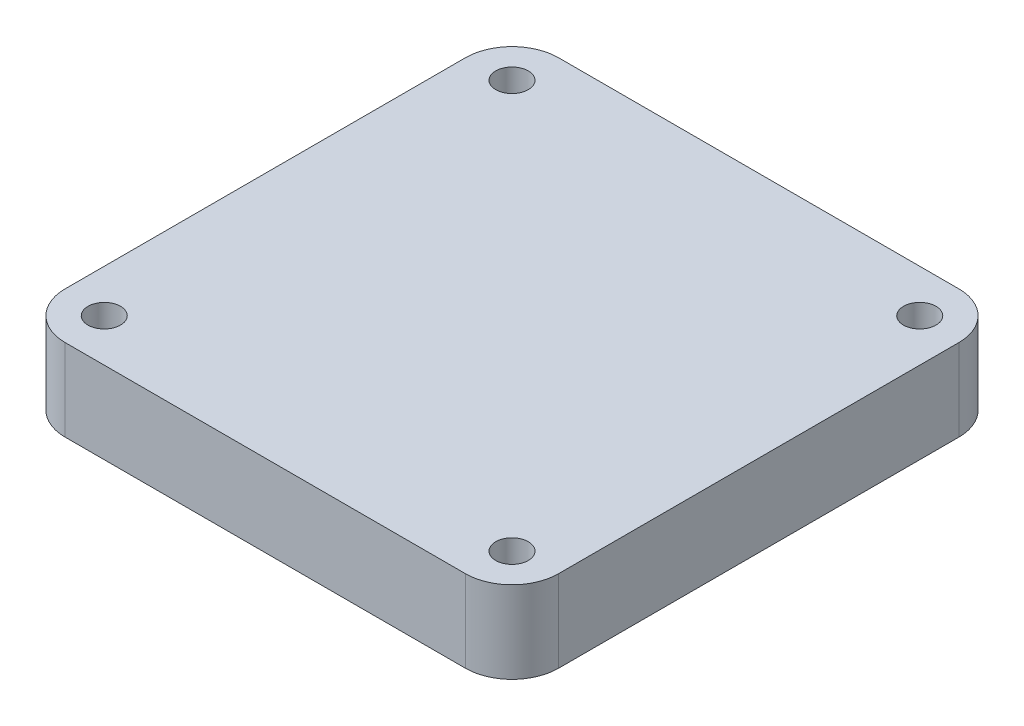
ISO-10303-21;
HEADER;
FILE_DESCRIPTION(('STEP AP214'),'2;1');
FILE_NAME('part.step','',(''),(''),'','','');
FILE_SCHEMA(('AUTOMOTIVE_DESIGN { 1 0 10303 214 1 1 1 1 }'));
ENDSEC;
DATA;
#1=APPLICATION_CONTEXT('core data for automotive mechanical design processes');
#2=APPLICATION_PROTOCOL_DEFINITION('international standard','automotive_design',2000,#1);
#3=PRODUCT_CONTEXT('',#1,'mechanical');
#4=PRODUCT('Part','Part','',(#3));
#5=PRODUCT_RELATED_PRODUCT_CATEGORY('part','',(#4));
#6=PRODUCT_DEFINITION_FORMATION('','',#4);
#7=PRODUCT_DEFINITION_CONTEXT('part definition',#1,'design');
#8=PRODUCT_DEFINITION('design','',#6,#7);
#9=PRODUCT_DEFINITION_SHAPE('','',#8);
#10=(LENGTH_UNIT() NAMED_UNIT(*) SI_UNIT(.MILLI.,.METRE.));
#11=(NAMED_UNIT(*) PLANE_ANGLE_UNIT() SI_UNIT($,.RADIAN.));
#12=(NAMED_UNIT(*) SI_UNIT($,.STERADIAN.) SOLID_ANGLE_UNIT());
#13=UNCERTAINTY_MEASURE_WITH_UNIT(LENGTH_MEASURE(1.E-05),#10,'distance_accuracy_value','');
#14=(GEOMETRIC_REPRESENTATION_CONTEXT(3) GLOBAL_UNCERTAINTY_ASSIGNED_CONTEXT((#13)) GLOBAL_UNIT_ASSIGNED_CONTEXT((#10,
#11,#12)) REPRESENTATION_CONTEXT('',''));
#15=CARTESIAN_POINT('',(0.,0.,0.));
#16=DIRECTION('',(0.,0.,1.));
#17=DIRECTION('',(1.,0.,0.));
#18=AXIS2_PLACEMENT_3D('',#15,#16,#17);
#19=CARTESIAN_POINT('',(0.,8.8,0.));
#20=DIRECTION('',(0.,1.,0.));
#21=DIRECTION('',(0.,0.,1.));
#22=AXIS2_PLACEMENT_3D('',#19,#20,#21);
#23=PLANE('',#22);
#24=CARTESIAN_POINT('',(21.9,8.8,21.9));
#25=DIRECTION('',(0.,1.,0.));
#26=DIRECTION('',(0.,0.,1.));
#27=AXIS2_PLACEMENT_3D('',#24,#25,#26);
#28=CIRCLE('',#27,1.75);
#29=CARTESIAN_POINT('',(21.9,8.8,23.65));
#30=VERTEX_POINT('',#29);
#31=EDGE_CURVE('E180',#30,#30,#28,.T.);
#32=ORIENTED_EDGE('',*,*,#31,.F.);
#33=EDGE_LOOP('',(#32));
#34=FACE_BOUND('',#33,.T.);
#35=CARTESIAN_POINT('',(-21.9,8.8,-21.9));
#36=DIRECTION('',(0.,1.,0.));
#37=DIRECTION('',(0.,0.,1.));
#38=AXIS2_PLACEMENT_3D('',#35,#36,#37);
#39=CIRCLE('',#38,1.75);
#40=CARTESIAN_POINT('',(-21.9,8.8,-20.15));
#41=VERTEX_POINT('',#40);
#42=EDGE_CURVE('E163',#41,#41,#39,.T.);
#43=ORIENTED_EDGE('',*,*,#42,.F.);
#44=EDGE_LOOP('',(#43));
#45=FACE_BOUND('',#44,.T.);
#46=DIRECTION('',(0.,0.,1.));
#47=VECTOR('',#46,1.);
#48=CARTESIAN_POINT('',(-26.5,8.8,-26.5));
#49=LINE('',#48,#47);
#50=CARTESIAN_POINT('',(-26.5,8.8,-21.5));
#51=VERTEX_POINT('',#50);
#52=CARTESIAN_POINT('',(-26.5,8.8,21.5));
#53=VERTEX_POINT('',#52);
#54=EDGE_CURVE('E170',#51,#53,#49,.T.);
#55=ORIENTED_EDGE('',*,*,#54,.T.);
#56=CARTESIAN_POINT('',(-21.5,8.8,21.5));
#57=DIRECTION('',(0.,1.,0.));
#58=DIRECTION('',(0.,0.,1.));
#59=AXIS2_PLACEMENT_3D('',#56,#57,#58);
#60=CIRCLE('',#59,5.);
#61=CARTESIAN_POINT('',(-21.5,8.8,26.5));
#62=VERTEX_POINT('',#61);
#63=EDGE_CURVE('E147',#53,#62,#60,.T.);
#64=ORIENTED_EDGE('',*,*,#63,.T.);
#65=DIRECTION('',(1.,0.,0.));
#66=VECTOR('',#65,1.);
#67=CARTESIAN_POINT('',(-26.5,8.8,26.5));
#68=LINE('',#67,#66);
#69=CARTESIAN_POINT('',(21.5,8.8,26.5));
#70=VERTEX_POINT('',#69);
#71=EDGE_CURVE('E118',#62,#70,#68,.T.);
#72=ORIENTED_EDGE('',*,*,#71,.T.);
#73=CARTESIAN_POINT('',(21.5,8.8,21.5));
#74=DIRECTION('',(0.,1.,0.));
#75=DIRECTION('',(0.,0.,1.));
#76=AXIS2_PLACEMENT_3D('',#73,#74,#75);
#77=CIRCLE('',#76,5.);
#78=CARTESIAN_POINT('',(26.5,8.8,21.5));
#79=VERTEX_POINT('',#78);
#80=EDGE_CURVE('E142',#70,#79,#77,.T.);
#81=ORIENTED_EDGE('',*,*,#80,.T.);
#82=DIRECTION('',(0.,0.,-1.));
#83=VECTOR('',#82,1.);
#84=CARTESIAN_POINT('',(26.5,8.8,-26.5));
#85=LINE('',#84,#83);
#86=CARTESIAN_POINT('',(26.5,8.8,-21.5));
#87=VERTEX_POINT('',#86);
#88=EDGE_CURVE('E125',#79,#87,#85,.T.);
#89=ORIENTED_EDGE('',*,*,#88,.T.);
#90=CARTESIAN_POINT('',(21.5,8.8,-21.5));
#91=DIRECTION('',(0.,1.,0.));
#92=DIRECTION('',(0.,0.,1.));
#93=AXIS2_PLACEMENT_3D('',#90,#91,#92);
#94=CIRCLE('',#93,5.);
#95=CARTESIAN_POINT('',(21.5,8.8,-26.5));
#96=VERTEX_POINT('',#95);
#97=EDGE_CURVE('E54',#87,#96,#94,.T.);
#98=ORIENTED_EDGE('',*,*,#97,.T.);
#99=DIRECTION('',(-1.,0.,0.));
#100=VECTOR('',#99,1.);
#101=CARTESIAN_POINT('',(-26.5,8.8,-26.5));
#102=LINE('',#101,#100);
#103=CARTESIAN_POINT('',(-21.5,8.8,-26.5));
#104=VERTEX_POINT('',#103);
#105=EDGE_CURVE('E128',#96,#104,#102,.T.);
#106=ORIENTED_EDGE('',*,*,#105,.T.);
#107=CARTESIAN_POINT('',(-21.5,8.8,-21.5));
#108=DIRECTION('',(0.,1.,0.));
#109=DIRECTION('',(0.,0.,1.));
#110=AXIS2_PLACEMENT_3D('',#107,#108,#109);
#111=CIRCLE('',#110,5.);
#112=EDGE_CURVE('E145',#104,#51,#111,.T.);
#113=ORIENTED_EDGE('',*,*,#112,.T.);
#114=EDGE_LOOP('',(#55,#64,#72,#81,#89,#98,#106,#113));
#115=FACE_BOUND('',#114,.T.);
#116=CARTESIAN_POINT('',(21.9,8.8,-21.9));
#117=DIRECTION('',(0.,1.,0.));
#118=DIRECTION('',(0.,0.,1.));
#119=AXIS2_PLACEMENT_3D('',#116,#117,#118);
#120=CIRCLE('',#119,1.75);
#121=CARTESIAN_POINT('',(21.9,8.8,-20.15));
#122=VERTEX_POINT('',#121);
#123=EDGE_CURVE('E175',#122,#122,#120,.T.);
#124=ORIENTED_EDGE('',*,*,#123,.F.);
#125=EDGE_LOOP('',(#124));
#126=FACE_BOUND('',#125,.T.);
#127=CARTESIAN_POINT('',(-21.9,8.8,21.9));
#128=DIRECTION('',(0.,1.,0.));
#129=DIRECTION('',(0.,0.,1.));
#130=AXIS2_PLACEMENT_3D('',#127,#128,#129);
#131=CIRCLE('',#130,1.75);
#132=CARTESIAN_POINT('',(-21.9,8.8,23.65));
#133=VERTEX_POINT('',#132);
#134=EDGE_CURVE('E186',#133,#133,#131,.T.);
#135=ORIENTED_EDGE('',*,*,#134,.F.);
#136=EDGE_LOOP('',(#135));
#137=FACE_BOUND('',#136,.T.);
#138=ADVANCED_FACE('F32',(#34,#45,#115,#126,#137),#23,.T.);
#139=CARTESIAN_POINT('',(0.,0.,0.));
#140=DIRECTION('',(0.,1.,0.));
#141=DIRECTION('',(0.,0.,1.));
#142=AXIS2_PLACEMENT_3D('',#139,#140,#141);
#143=PLANE('',#142);
#144=CARTESIAN_POINT('',(21.9,0.,21.9));
#145=DIRECTION('',(0.,1.,0.));
#146=DIRECTION('',(0.,0.,1.));
#147=AXIS2_PLACEMENT_3D('',#144,#145,#146);
#148=CIRCLE('',#147,1.75);
#149=CARTESIAN_POINT('',(21.9,0.,23.65));
#150=VERTEX_POINT('',#149);
#151=EDGE_CURVE('E183',#150,#150,#148,.T.);
#152=ORIENTED_EDGE('',*,*,#151,.T.);
#153=EDGE_LOOP('',(#152));
#154=FACE_BOUND('',#153,.T.);
#155=CARTESIAN_POINT('',(-21.9,0.,-21.9));
#156=DIRECTION('',(0.,1.,0.));
#157=DIRECTION('',(0.,0.,1.));
#158=AXIS2_PLACEMENT_3D('',#155,#156,#157);
#159=CIRCLE('',#158,1.75);
#160=CARTESIAN_POINT('',(-21.9,0.,-20.15));
#161=VERTEX_POINT('',#160);
#162=EDGE_CURVE('E166',#161,#161,#159,.T.);
#163=ORIENTED_EDGE('',*,*,#162,.T.);
#164=EDGE_LOOP('',(#163));
#165=FACE_BOUND('',#164,.T.);
#166=DIRECTION('',(1.,0.,0.));
#167=VECTOR('',#166,1.);
#168=CARTESIAN_POINT('',(-26.5,0.,26.5));
#169=LINE('',#168,#167);
#170=CARTESIAN_POINT('',(-21.5,0.,26.5));
#171=VERTEX_POINT('',#170);
#172=CARTESIAN_POINT('',(21.5,0.,26.5));
#173=VERTEX_POINT('',#172);
#174=EDGE_CURVE('E115',#171,#173,#169,.T.);
#175=ORIENTED_EDGE('',*,*,#174,.F.);
#176=CARTESIAN_POINT('',(-21.5,0.,21.5));
#177=DIRECTION('',(0.,1.,0.));
#178=DIRECTION('',(0.,0.,1.));
#179=AXIS2_PLACEMENT_3D('',#176,#177,#178);
#180=CIRCLE('',#179,5.);
#181=CARTESIAN_POINT('',(-26.5,0.,21.5));
#182=VERTEX_POINT('',#181);
#183=EDGE_CURVE('E98',#171,#182,#180,.F.);
#184=ORIENTED_EDGE('',*,*,#183,.T.);
#185=DIRECTION('',(0.,0.,1.));
#186=VECTOR('',#185,1.);
#187=CARTESIAN_POINT('',(-26.5,0.,-26.5));
#188=LINE('',#187,#186);
#189=CARTESIAN_POINT('',(-26.5,0.,-21.5));
#190=VERTEX_POINT('',#189);
#191=EDGE_CURVE('E126',#190,#182,#188,.T.);
#192=ORIENTED_EDGE('',*,*,#191,.F.);
#193=CARTESIAN_POINT('',(-21.5,0.,-21.5));
#194=DIRECTION('',(0.,1.,0.));
#195=DIRECTION('',(0.,0.,1.));
#196=AXIS2_PLACEMENT_3D('',#193,#194,#195);
#197=CIRCLE('',#196,5.);
#198=CARTESIAN_POINT('',(-21.5,0.,-26.5));
#199=VERTEX_POINT('',#198);
#200=EDGE_CURVE('E109',#190,#199,#197,.F.);
#201=ORIENTED_EDGE('',*,*,#200,.T.);
#202=DIRECTION('',(-1.,0.,0.));
#203=VECTOR('',#202,1.);
#204=CARTESIAN_POINT('',(-26.5,0.,-26.5));
#205=LINE('',#204,#203);
#206=CARTESIAN_POINT('',(21.5,0.,-26.5));
#207=VERTEX_POINT('',#206);
#208=EDGE_CURVE('E130',#207,#199,#205,.T.);
#209=ORIENTED_EDGE('',*,*,#208,.F.);
#210=CARTESIAN_POINT('',(21.5,0.,-21.5));
#211=DIRECTION('',(0.,1.,0.));
#212=DIRECTION('',(0.,0.,1.));
#213=AXIS2_PLACEMENT_3D('',#210,#211,#212);
#214=CIRCLE('',#213,5.);
#215=CARTESIAN_POINT('',(26.5,0.,-21.5));
#216=VERTEX_POINT('',#215);
#217=EDGE_CURVE('E136',#207,#216,#214,.F.);
#218=ORIENTED_EDGE('',*,*,#217,.T.);
#219=DIRECTION('',(0.,0.,-1.));
#220=VECTOR('',#219,1.);
#221=CARTESIAN_POINT('',(26.5,0.,-26.5));
#222=LINE('',#221,#220);
#223=CARTESIAN_POINT('',(26.5,0.,21.5));
#224=VERTEX_POINT('',#223);
#225=EDGE_CURVE('E158',#224,#216,#222,.T.);
#226=ORIENTED_EDGE('',*,*,#225,.F.);
#227=CARTESIAN_POINT('',(21.5,0.,21.5));
#228=DIRECTION('',(0.,1.,0.));
#229=DIRECTION('',(0.,0.,1.));
#230=AXIS2_PLACEMENT_3D('',#227,#228,#229);
#231=CIRCLE('',#230,5.);
#232=EDGE_CURVE('E119',#224,#173,#231,.F.);
#233=ORIENTED_EDGE('',*,*,#232,.T.);
#234=EDGE_LOOP('',(#175,#184,#192,#201,#209,#218,#226,#233));
#235=FACE_BOUND('',#234,.T.);
#236=CARTESIAN_POINT('',(21.9,0.,-21.9));
#237=DIRECTION('',(0.,1.,0.));
#238=DIRECTION('',(0.,0.,1.));
#239=AXIS2_PLACEMENT_3D('',#236,#237,#238);
#240=CIRCLE('',#239,1.75);
#241=CARTESIAN_POINT('',(21.9,0.,-20.15));
#242=VERTEX_POINT('',#241);
#243=EDGE_CURVE('E177',#242,#242,#240,.T.);
#244=ORIENTED_EDGE('',*,*,#243,.T.);
#245=EDGE_LOOP('',(#244));
#246=FACE_BOUND('',#245,.T.);
#247=CARTESIAN_POINT('',(-21.9,0.,21.9));
#248=DIRECTION('',(0.,1.,0.));
#249=DIRECTION('',(0.,0.,1.));
#250=AXIS2_PLACEMENT_3D('',#247,#248,#249);
#251=CIRCLE('',#250,1.75);
#252=CARTESIAN_POINT('',(-21.9,0.,23.65));
#253=VERTEX_POINT('',#252);
#254=EDGE_CURVE('E189',#253,#253,#251,.T.);
#255=ORIENTED_EDGE('',*,*,#254,.T.);
#256=EDGE_LOOP('',(#255));
#257=FACE_BOUND('',#256,.T.);
#258=ADVANCED_FACE('F122',(#154,#165,#235,#246,#257),#143,.F.);
#259=CARTESIAN_POINT('',(26.5,8.8,-26.5));
#260=DIRECTION('',(-1.,0.,0.));
#261=DIRECTION('',(0.,0.,1.));
#262=AXIS2_PLACEMENT_3D('',#259,#260,#261);
#263=PLANE('',#262);
#264=ORIENTED_EDGE('',*,*,#225,.T.);
#265=DIRECTION('',(0.,-1.,0.));
#266=VECTOR('',#265,1.);
#267=CARTESIAN_POINT('',(26.5,8.8,-21.5));
#268=LINE('',#267,#266);
#269=EDGE_CURVE('E11',#216,#87,#268,.F.);
#270=ORIENTED_EDGE('',*,*,#269,.T.);
#271=ORIENTED_EDGE('',*,*,#88,.F.);
#272=DIRECTION('',(0.,-1.,0.));
#273=VECTOR('',#272,1.);
#274=CARTESIAN_POINT('',(26.5,8.8,21.5));
#275=LINE('',#274,#273);
#276=EDGE_CURVE('E40',#79,#224,#275,.T.);
#277=ORIENTED_EDGE('',*,*,#276,.T.);
#278=EDGE_LOOP('',(#264,#270,#271,#277));
#279=FACE_BOUND('',#278,.T.);
#280=ADVANCED_FACE('F157',(#279),#263,.F.);
#281=CARTESIAN_POINT('',(-26.5,8.8,-26.5));
#282=DIRECTION('',(0.,0.,1.));
#283=DIRECTION('',(1.,0.,0.));
#284=AXIS2_PLACEMENT_3D('',#281,#282,#283);
#285=PLANE('',#284);
#286=ORIENTED_EDGE('',*,*,#208,.T.);
#287=DIRECTION('',(0.,-1.,0.));
#288=VECTOR('',#287,1.);
#289=CARTESIAN_POINT('',(-21.5,8.8,-26.5));
#290=LINE('',#289,#288);
#291=EDGE_CURVE('E47',#199,#104,#290,.F.);
#292=ORIENTED_EDGE('',*,*,#291,.T.);
#293=ORIENTED_EDGE('',*,*,#105,.F.);
#294=DIRECTION('',(0.,-1.,0.));
#295=VECTOR('',#294,1.);
#296=CARTESIAN_POINT('',(21.5,8.8,-26.5));
#297=LINE('',#296,#295);
#298=EDGE_CURVE('E149',#96,#207,#297,.T.);
#299=ORIENTED_EDGE('',*,*,#298,.T.);
#300=EDGE_LOOP('',(#286,#292,#293,#299));
#301=FACE_BOUND('',#300,.T.);
#302=ADVANCED_FACE('F217',(#301),#285,.F.);
#303=CARTESIAN_POINT('',(-26.5,8.8,-26.5));
#304=DIRECTION('',(1.,0.,0.));
#305=DIRECTION('',(0.,0.,-1.));
#306=AXIS2_PLACEMENT_3D('',#303,#304,#305);
#307=PLANE('',#306);
#308=ORIENTED_EDGE('',*,*,#191,.T.);
#309=DIRECTION('',(0.,-1.,0.));
#310=VECTOR('',#309,1.);
#311=CARTESIAN_POINT('',(-26.5,8.8,21.5));
#312=LINE('',#311,#310);
#313=EDGE_CURVE('E103',#182,#53,#312,.F.);
#314=ORIENTED_EDGE('',*,*,#313,.T.);
#315=ORIENTED_EDGE('',*,*,#54,.F.);
#316=DIRECTION('',(0.,-1.,0.));
#317=VECTOR('',#316,1.);
#318=CARTESIAN_POINT('',(-26.5,8.8,-21.5));
#319=LINE('',#318,#317);
#320=EDGE_CURVE('E108',#51,#190,#319,.T.);
#321=ORIENTED_EDGE('',*,*,#320,.T.);
#322=EDGE_LOOP('',(#308,#314,#315,#321));
#323=FACE_BOUND('',#322,.T.);
#324=ADVANCED_FACE('F214',(#323),#307,.F.);
#325=CARTESIAN_POINT('',(-26.5,8.8,26.5));
#326=DIRECTION('',(0.,0.,-1.));
#327=DIRECTION('',(-1.,0.,0.));
#328=AXIS2_PLACEMENT_3D('',#325,#326,#327);
#329=PLANE('',#328);
#330=ORIENTED_EDGE('',*,*,#71,.F.);
#331=DIRECTION('',(0.,-1.,0.));
#332=VECTOR('',#331,1.);
#333=CARTESIAN_POINT('',(-21.5,8.8,26.5));
#334=LINE('',#333,#332);
#335=EDGE_CURVE('E102',#62,#171,#334,.T.);
#336=ORIENTED_EDGE('',*,*,#335,.T.);
#337=ORIENTED_EDGE('',*,*,#174,.T.);
#338=DIRECTION('',(0.,-1.,0.));
#339=VECTOR('',#338,1.);
#340=CARTESIAN_POINT('',(21.5,8.8,26.5));
#341=LINE('',#340,#339);
#342=EDGE_CURVE('E120',#173,#70,#341,.F.);
#343=ORIENTED_EDGE('',*,*,#342,.T.);
#344=EDGE_LOOP('',(#330,#336,#337,#343));
#345=FACE_BOUND('',#344,.T.);
#346=ADVANCED_FACE('F114',(#345),#329,.F.);
#347=CARTESIAN_POINT('',(-21.9,8.8,-21.9));
#348=DIRECTION('',(0.,-1.,0.));
#349=DIRECTION('',(0.,0.,-1.));
#350=AXIS2_PLACEMENT_3D('',#347,#348,#349);
#351=CYLINDRICAL_SURFACE('',#350,1.75);
#352=ORIENTED_EDGE('',*,*,#42,.T.);
#353=EDGE_LOOP('',(#352));
#354=FACE_BOUND('',#353,.T.);
#355=ORIENTED_EDGE('',*,*,#162,.F.);
#356=EDGE_LOOP('',(#355));
#357=FACE_BOUND('',#356,.T.);
#358=ADVANCED_FACE('F209',(#354,#357),#351,.F.);
#359=CARTESIAN_POINT('',(21.9,8.8,-21.9));
#360=DIRECTION('',(0.,-1.,0.));
#361=DIRECTION('',(0.,0.,-1.));
#362=AXIS2_PLACEMENT_3D('',#359,#360,#361);
#363=CYLINDRICAL_SURFACE('',#362,1.75);
#364=ORIENTED_EDGE('',*,*,#123,.T.);
#365=EDGE_LOOP('',(#364));
#366=FACE_BOUND('',#365,.T.);
#367=ORIENTED_EDGE('',*,*,#243,.F.);
#368=EDGE_LOOP('',(#367));
#369=FACE_BOUND('',#368,.T.);
#370=ADVANCED_FACE('F241',(#366,#369),#363,.F.);
#371=CARTESIAN_POINT('',(21.9,8.8,21.9));
#372=DIRECTION('',(0.,-1.,0.));
#373=DIRECTION('',(0.,0.,-1.));
#374=AXIS2_PLACEMENT_3D('',#371,#372,#373);
#375=CYLINDRICAL_SURFACE('',#374,1.75);
#376=ORIENTED_EDGE('',*,*,#31,.T.);
#377=EDGE_LOOP('',(#376));
#378=FACE_BOUND('',#377,.T.);
#379=ORIENTED_EDGE('',*,*,#151,.F.);
#380=EDGE_LOOP('',(#379));
#381=FACE_BOUND('',#380,.T.);
#382=ADVANCED_FACE('F244',(#378,#381),#375,.F.);
#383=CARTESIAN_POINT('',(-21.9,8.8,21.9));
#384=DIRECTION('',(0.,-1.,0.));
#385=DIRECTION('',(0.,0.,-1.));
#386=AXIS2_PLACEMENT_3D('',#383,#384,#385);
#387=CYLINDRICAL_SURFACE('',#386,1.75);
#388=ORIENTED_EDGE('',*,*,#134,.T.);
#389=EDGE_LOOP('',(#388));
#390=FACE_BOUND('',#389,.T.);
#391=ORIENTED_EDGE('',*,*,#254,.F.);
#392=EDGE_LOOP('',(#391));
#393=FACE_BOUND('',#392,.T.);
#394=ADVANCED_FACE('F195',(#390,#393),#387,.F.);
#395=CARTESIAN_POINT('',(-21.5,8.8,21.5));
#396=DIRECTION('',(0.,-1.,0.));
#397=DIRECTION('',(0.,0.,-1.));
#398=AXIS2_PLACEMENT_3D('',#395,#396,#397);
#399=CYLINDRICAL_SURFACE('',#398,5.);
#400=ORIENTED_EDGE('',*,*,#63,.F.);
#401=ORIENTED_EDGE('',*,*,#313,.F.);
#402=ORIENTED_EDGE('',*,*,#183,.F.);
#403=ORIENTED_EDGE('',*,*,#335,.F.);
#404=EDGE_LOOP('',(#400,#401,#402,#403));
#405=FACE_BOUND('',#404,.T.);
#406=ADVANCED_FACE('F101',(#405),#399,.T.);
#407=CARTESIAN_POINT('',(-21.5,8.8,-21.5));
#408=DIRECTION('',(0.,-1.,0.));
#409=DIRECTION('',(0.,0.,-1.));
#410=AXIS2_PLACEMENT_3D('',#407,#408,#409);
#411=CYLINDRICAL_SURFACE('',#410,5.);
#412=ORIENTED_EDGE('',*,*,#112,.F.);
#413=ORIENTED_EDGE('',*,*,#291,.F.);
#414=ORIENTED_EDGE('',*,*,#200,.F.);
#415=ORIENTED_EDGE('',*,*,#320,.F.);
#416=EDGE_LOOP('',(#412,#413,#414,#415));
#417=FACE_BOUND('',#416,.T.);
#418=ADVANCED_FACE('F225',(#417),#411,.T.);
#419=CARTESIAN_POINT('',(21.5,8.8,-21.5));
#420=DIRECTION('',(0.,-1.,0.));
#421=DIRECTION('',(0.,0.,-1.));
#422=AXIS2_PLACEMENT_3D('',#419,#420,#421);
#423=CYLINDRICAL_SURFACE('',#422,5.);
#424=ORIENTED_EDGE('',*,*,#97,.F.);
#425=ORIENTED_EDGE('',*,*,#269,.F.);
#426=ORIENTED_EDGE('',*,*,#217,.F.);
#427=ORIENTED_EDGE('',*,*,#298,.F.);
#428=EDGE_LOOP('',(#424,#425,#426,#427));
#429=FACE_BOUND('',#428,.T.);
#430=ADVANCED_FACE('F227',(#429),#423,.T.);
#431=CARTESIAN_POINT('',(21.5,8.8,21.5));
#432=DIRECTION('',(0.,-1.,0.));
#433=DIRECTION('',(0.,0.,-1.));
#434=AXIS2_PLACEMENT_3D('',#431,#432,#433);
#435=CYLINDRICAL_SURFACE('',#434,5.);
#436=ORIENTED_EDGE('',*,*,#80,.F.);
#437=ORIENTED_EDGE('',*,*,#342,.F.);
#438=ORIENTED_EDGE('',*,*,#232,.F.);
#439=ORIENTED_EDGE('',*,*,#276,.F.);
#440=EDGE_LOOP('',(#436,#437,#438,#439));
#441=FACE_BOUND('',#440,.T.);
#442=ADVANCED_FACE('F34',(#441),#435,.T.);
#443=CLOSED_SHELL('',(#138,#258,#280,#302,#324,#346,#358,#370,#382,#394,#406,#418,#430,#442));
#444=MANIFOLD_SOLID_BREP('B2',#443);
#445=ADVANCED_BREP_SHAPE_REPRESENTATION('',(#18,#444),#14);
#446=SHAPE_DEFINITION_REPRESENTATION(#9,#445);
ENDSEC;
END-ISO-10303-21;
